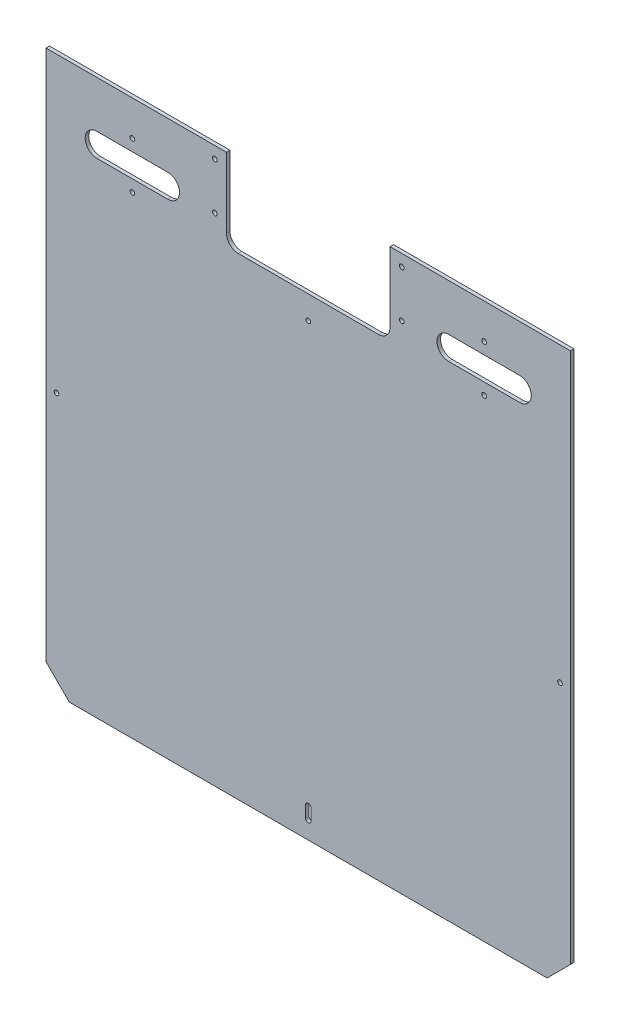
ISO-10303-21;
HEADER;
FILE_DESCRIPTION(('STEP AP214'),'2;1');
FILE_NAME('part.step','',(''),(''),'','','');
FILE_SCHEMA(('AUTOMOTIVE_DESIGN { 1 0 10303 214 1 1 1 1 }'));
ENDSEC;
DATA;
#1=APPLICATION_CONTEXT('core data for automotive mechanical design processes');
#2=APPLICATION_PROTOCOL_DEFINITION('international standard','automotive_design',2000,#1);
#3=PRODUCT_CONTEXT('',#1,'mechanical');
#4=PRODUCT('Part','Part','',(#3));
#5=PRODUCT_RELATED_PRODUCT_CATEGORY('part','',(#4));
#6=PRODUCT_DEFINITION_FORMATION('','',#4);
#7=PRODUCT_DEFINITION_CONTEXT('part definition',#1,'design');
#8=PRODUCT_DEFINITION('design','',#6,#7);
#9=PRODUCT_DEFINITION_SHAPE('','',#8);
#10=(LENGTH_UNIT() NAMED_UNIT(*) SI_UNIT(.MILLI.,.METRE.));
#11=(NAMED_UNIT(*) PLANE_ANGLE_UNIT() SI_UNIT($,.RADIAN.));
#12=(NAMED_UNIT(*) SI_UNIT($,.STERADIAN.) SOLID_ANGLE_UNIT());
#13=UNCERTAINTY_MEASURE_WITH_UNIT(LENGTH_MEASURE(1.E-05),#10,'distance_accuracy_value','');
#14=(GEOMETRIC_REPRESENTATION_CONTEXT(3) GLOBAL_UNCERTAINTY_ASSIGNED_CONTEXT((#13)) GLOBAL_UNIT_ASSIGNED_CONTEXT((#10,
#11,#12)) REPRESENTATION_CONTEXT('',''));
#15=CARTESIAN_POINT('',(0.,0.,0.));
#16=DIRECTION('',(0.,0.,1.));
#17=DIRECTION('',(1.,0.,0.));
#18=AXIS2_PLACEMENT_3D('',#15,#16,#17);
#19=CARTESIAN_POINT('',(164.5,415.,3.));
#20=DIRECTION('',(0.,0.,1.));
#21=DIRECTION('',(1.,0.,0.));
#22=AXIS2_PLACEMENT_3D('',#19,#20,#21);
#23=PLANE('',#22);
#24=CARTESIAN_POINT('',(304.5,425.,3.));
#25=DIRECTION('',(0.,0.,1.));
#26=DIRECTION('',(-1.,0.,0.));
#27=AXIS2_PLACEMENT_3D('',#24,#25,#26);
#28=CIRCLE('',#27,2.);
#29=CARTESIAN_POINT('',(302.5,425.,3.));
#30=VERTEX_POINT('',#29);
#31=EDGE_CURVE('E815',#30,#30,#28,.T.);
#32=ORIENTED_EDGE('',*,*,#31,.F.);
#33=EDGE_LOOP('',(#32));
#34=FACE_BOUND('',#33,.T.);
#35=CARTESIAN_POINT('',(375.078127511441,445.,3.));
#36=DIRECTION('',(0.,0.,1.));
#37=DIRECTION('',(-1.,0.,0.));
#38=AXIS2_PLACEMENT_3D('',#35,#36,#37);
#39=CIRCLE('',#38,2.);
#40=CARTESIAN_POINT('',(373.078127511441,445.,3.));
#41=VERTEX_POINT('',#40);
#42=EDGE_CURVE('E827',#41,#41,#39,.T.);
#43=ORIENTED_EDGE('',*,*,#42,.F.);
#44=EDGE_LOOP('',(#43));
#45=FACE_BOUND('',#44,.T.);
#46=CARTESIAN_POINT('',(73.9218724885587,405.,3.));
#47=DIRECTION('',(0.,0.,1.));
#48=DIRECTION('',(-1.,0.,0.));
#49=AXIS2_PLACEMENT_3D('',#46,#47,#48);
#50=CIRCLE('',#49,2.);
#51=CARTESIAN_POINT('',(71.9218724885587,405.,3.));
#52=VERTEX_POINT('',#51);
#53=EDGE_CURVE('E839',#52,#52,#50,.T.);
#54=ORIENTED_EDGE('',*,*,#53,.F.);
#55=EDGE_LOOP('',(#54));
#56=FACE_BOUND('',#55,.T.);
#57=DIRECTION('',(0.,1.,0.));
#58=VECTOR('',#57,1.);
#59=CARTESIAN_POINT('',(226.75,15.,3.));
#60=LINE('',#59,#58);
#61=CARTESIAN_POINT('',(226.75,15.,3.));
#62=VERTEX_POINT('',#61);
#63=CARTESIAN_POINT('',(226.75,25.,3.));
#64=VERTEX_POINT('',#63);
#65=EDGE_CURVE('E204',#62,#64,#60,.T.);
#66=ORIENTED_EDGE('',*,*,#65,.F.);
#67=CARTESIAN_POINT('',(224.5,15.,3.));
#68=DIRECTION('',(0.,0.,1.));
#69=DIRECTION('',(1.,0.,0.));
#70=AXIS2_PLACEMENT_3D('',#67,#68,#69);
#71=CIRCLE('',#70,2.24999999999997);
#72=CARTESIAN_POINT('',(222.25,15.,3.));
#73=VERTEX_POINT('',#72);
#74=EDGE_CURVE('E196',#73,#62,#71,.T.);
#75=ORIENTED_EDGE('',*,*,#74,.F.);
#76=DIRECTION('',(0.,-1.,0.));
#77=VECTOR('',#76,1.);
#78=CARTESIAN_POINT('',(222.25,15.,3.));
#79=LINE('',#78,#77);
#80=CARTESIAN_POINT('',(222.25,25.,3.));
#81=VERTEX_POINT('',#80);
#82=EDGE_CURVE('E219',#81,#73,#79,.T.);
#83=ORIENTED_EDGE('',*,*,#82,.F.);
#84=CARTESIAN_POINT('',(224.5,25.,3.));
#85=DIRECTION('',(0.,0.,1.));
#86=DIRECTION('',(1.,0.,0.));
#87=AXIS2_PLACEMENT_3D('',#84,#85,#86);
#88=CIRCLE('',#87,2.25);
#89=EDGE_CURVE('E217',#64,#81,#88,.T.);
#90=ORIENTED_EDGE('',*,*,#89,.F.);
#91=EDGE_LOOP('',(#66,#75,#83,#90));
#92=FACE_BOUND('',#91,.T.);
#93=DIRECTION('',(1.,0.,0.));
#94=VECTOR('',#93,1.);
#95=CARTESIAN_POINT('',(344.715899344631,415.,3.));
#96=LINE('',#95,#94);
#97=CARTESIAN_POINT('',(344.715899344631,415.,3.));
#98=VERTEX_POINT('',#97);
#99=CARTESIAN_POINT('',(405.440355678252,415.,3.));
#100=VERTEX_POINT('',#99);
#101=EDGE_CURVE('E268',#98,#100,#96,.T.);
#102=ORIENTED_EDGE('',*,*,#101,.F.);
#103=CARTESIAN_POINT('',(344.715899344631,425.,3.));
#104=DIRECTION('',(0.,0.,1.));
#105=DIRECTION('',(1.,0.,0.));
#106=AXIS2_PLACEMENT_3D('',#103,#104,#105);
#107=CIRCLE('',#106,9.99999999999995);
#108=CARTESIAN_POINT('',(344.715899344631,435.,3.));
#109=VERTEX_POINT('',#108);
#110=EDGE_CURVE('E266',#109,#98,#107,.T.);
#111=ORIENTED_EDGE('',*,*,#110,.F.);
#112=DIRECTION('',(-1.,0.,0.));
#113=VECTOR('',#112,1.);
#114=CARTESIAN_POINT('',(344.715899344631,435.,3.));
#115=LINE('',#114,#113);
#116=CARTESIAN_POINT('',(405.440355678252,435.,3.));
#117=VERTEX_POINT('',#116);
#118=EDGE_CURVE('E274',#117,#109,#115,.T.);
#119=ORIENTED_EDGE('',*,*,#118,.F.);
#120=CARTESIAN_POINT('',(405.440355678252,425.,3.));
#121=DIRECTION('',(0.,0.,1.));
#122=DIRECTION('',(1.,0.,0.));
#123=AXIS2_PLACEMENT_3D('',#120,#121,#122);
#124=CIRCLE('',#123,9.99999999999995);
#125=EDGE_CURVE('E271',#100,#117,#124,.T.);
#126=ORIENTED_EDGE('',*,*,#125,.F.);
#127=EDGE_LOOP('',(#102,#111,#119,#126));
#128=FACE_BOUND('',#127,.T.);
#129=CARTESIAN_POINT('',(9.,223.826386398669,3.));
#130=DIRECTION('',(0.,0.,1.));
#131=DIRECTION('',(1.,0.,0.));
#132=AXIS2_PLACEMENT_3D('',#129,#130,#131);
#133=CIRCLE('',#132,2.);
#134=CARTESIAN_POINT('',(11.,223.826386398669,3.));
#135=VERTEX_POINT('',#134);
#136=EDGE_CURVE('E303',#135,#135,#133,.T.);
#137=ORIENTED_EDGE('',*,*,#136,.F.);
#138=EDGE_LOOP('',(#137));
#139=FACE_BOUND('',#138,.T.);
#140=CARTESIAN_POINT('',(144.5,425.,3.));
#141=DIRECTION('',(0.,0.,1.));
#142=DIRECTION('',(1.,0.,0.));
#143=AXIS2_PLACEMENT_3D('',#140,#141,#142);
#144=CIRCLE('',#143,2.);
#145=CARTESIAN_POINT('',(146.5,425.,3.));
#146=VERTEX_POINT('',#145);
#147=EDGE_CURVE('E315',#146,#146,#144,.T.);
#148=ORIENTED_EDGE('',*,*,#147,.F.);
#149=EDGE_LOOP('',(#148));
#150=FACE_BOUND('',#149,.T.);
#151=DIRECTION('',(-1.,0.,0.));
#152=VECTOR('',#151,1.);
#153=CARTESIAN_POINT('',(0.,475.,3.));
#154=LINE('',#153,#152);
#155=CARTESIAN_POINT('',(154.5,475.,3.));
#156=VERTEX_POINT('',#155);
#157=CARTESIAN_POINT('',(0.,475.,3.));
#158=VERTEX_POINT('',#157);
#159=EDGE_CURVE('E321',#156,#158,#154,.T.);
#160=ORIENTED_EDGE('',*,*,#159,.T.);
#161=DIRECTION('',(0.,-1.,0.));
#162=VECTOR('',#161,1.);
#163=CARTESIAN_POINT('',(0.,20.,3.));
#164=LINE('',#163,#162);
#165=CARTESIAN_POINT('',(0.,20.,3.));
#166=VERTEX_POINT('',#165);
#167=EDGE_CURVE('E324',#158,#166,#164,.T.);
#168=ORIENTED_EDGE('',*,*,#167,.T.);
#169=DIRECTION('',(0.707106781186548,-0.707106781186548,0.));
#170=VECTOR('',#169,1.);
#171=CARTESIAN_POINT('',(20.,0.,3.));
#172=LINE('',#171,#170);
#173=CARTESIAN_POINT('',(20.,0.,3.));
#174=VERTEX_POINT('',#173);
#175=EDGE_CURVE('E327',#166,#174,#172,.T.);
#176=ORIENTED_EDGE('',*,*,#175,.T.);
#177=DIRECTION('',(1.,0.,0.));
#178=VECTOR('',#177,1.);
#179=CARTESIAN_POINT('',(429.,0.,3.));
#180=LINE('',#179,#178);
#181=CARTESIAN_POINT('',(429.,0.,3.));
#182=VERTEX_POINT('',#181);
#183=EDGE_CURVE('E329',#174,#182,#180,.T.);
#184=ORIENTED_EDGE('',*,*,#183,.T.);
#185=DIRECTION('',(0.70710678118655,0.707106781186545,0.));
#186=VECTOR('',#185,1.);
#187=CARTESIAN_POINT('',(449.,20.,3.));
#188=LINE('',#187,#186);
#189=CARTESIAN_POINT('',(449.,20.,3.));
#190=VERTEX_POINT('',#189);
#191=EDGE_CURVE('E331',#182,#190,#188,.T.);
#192=ORIENTED_EDGE('',*,*,#191,.T.);
#193=DIRECTION('',(0.,1.,0.));
#194=VECTOR('',#193,1.);
#195=CARTESIAN_POINT('',(449.,475.,3.));
#196=LINE('',#195,#194);
#197=CARTESIAN_POINT('',(449.,475.,3.));
#198=VERTEX_POINT('',#197);
#199=EDGE_CURVE('E333',#190,#198,#196,.T.);
#200=ORIENTED_EDGE('',*,*,#199,.T.);
#201=DIRECTION('',(-1.,0.,0.));
#202=VECTOR('',#201,1.);
#203=CARTESIAN_POINT('',(294.5,475.,3.));
#204=LINE('',#203,#202);
#205=CARTESIAN_POINT('',(294.5,475.,3.));
#206=VERTEX_POINT('',#205);
#207=EDGE_CURVE('E335',#198,#206,#204,.T.);
#208=ORIENTED_EDGE('',*,*,#207,.T.);
#209=DIRECTION('',(0.,-1.,0.));
#210=VECTOR('',#209,1.);
#211=CARTESIAN_POINT('',(294.5,415.,3.));
#212=LINE('',#211,#210);
#213=CARTESIAN_POINT('',(294.5,415.,3.));
#214=VERTEX_POINT('',#213);
#215=EDGE_CURVE('E337',#206,#214,#212,.T.);
#216=ORIENTED_EDGE('',*,*,#215,.T.);
#217=CARTESIAN_POINT('',(284.5,415.,3.));
#218=DIRECTION('',(0.,0.,-1.));
#219=DIRECTION('',(-1.,0.,0.));
#220=AXIS2_PLACEMENT_3D('',#217,#218,#219);
#221=CIRCLE('',#220,10.);
#222=CARTESIAN_POINT('',(284.5,405.,3.));
#223=VERTEX_POINT('',#222);
#224=EDGE_CURVE('E339',#214,#223,#221,.T.);
#225=ORIENTED_EDGE('',*,*,#224,.T.);
#226=DIRECTION('',(-1.,0.,0.));
#227=VECTOR('',#226,1.);
#228=CARTESIAN_POINT('',(164.5,405.,3.));
#229=LINE('',#228,#227);
#230=CARTESIAN_POINT('',(164.5,405.,3.));
#231=VERTEX_POINT('',#230);
#232=EDGE_CURVE('E341',#223,#231,#229,.T.);
#233=ORIENTED_EDGE('',*,*,#232,.T.);
#234=CARTESIAN_POINT('',(164.5,415.,3.));
#235=DIRECTION('',(0.,0.,-1.));
#236=DIRECTION('',(1.,0.,0.));
#237=AXIS2_PLACEMENT_3D('',#234,#235,#236);
#238=CIRCLE('',#237,10.);
#239=CARTESIAN_POINT('',(154.5,415.,3.));
#240=VERTEX_POINT('',#239);
#241=EDGE_CURVE('E343',#231,#240,#238,.T.);
#242=ORIENTED_EDGE('',*,*,#241,.T.);
#243=DIRECTION('',(0.,1.,0.));
#244=VECTOR('',#243,1.);
#245=CARTESIAN_POINT('',(154.5,475.,3.));
#246=LINE('',#245,#244);
#247=EDGE_CURVE('E345',#240,#156,#246,.T.);
#248=ORIENTED_EDGE('',*,*,#247,.T.);
#249=EDGE_LOOP('',(#160,#168,#176,#184,#192,#200,#208,#216,#225,#233,#242,#248));
#250=FACE_BOUND('',#249,.T.);
#251=CARTESIAN_POINT('',(224.5,385.,3.));
#252=DIRECTION('',(0.,0.,1.));
#253=DIRECTION('',(1.,0.,0.));
#254=AXIS2_PLACEMENT_3D('',#251,#252,#253);
#255=CIRCLE('',#254,2.);
#256=CARTESIAN_POINT('',(226.5,385.,3.));
#257=VERTEX_POINT('',#256);
#258=EDGE_CURVE('E309',#257,#257,#255,.T.);
#259=ORIENTED_EDGE('',*,*,#258,.F.);
#260=EDGE_LOOP('',(#259));
#261=FACE_BOUND('',#260,.T.);
#262=CARTESIAN_POINT('',(440.,224.5,3.));
#263=DIRECTION('',(0.,0.,1.));
#264=DIRECTION('',(1.,0.,0.));
#265=AXIS2_PLACEMENT_3D('',#262,#263,#264);
#266=CIRCLE('',#265,2.);
#267=CARTESIAN_POINT('',(442.,224.5,3.));
#268=VERTEX_POINT('',#267);
#269=EDGE_CURVE('E297',#268,#268,#266,.T.);
#270=ORIENTED_EDGE('',*,*,#269,.F.);
#271=EDGE_LOOP('',(#270));
#272=FACE_BOUND('',#271,.T.);
#273=DIRECTION('',(-1.,0.,0.));
#274=VECTOR('',#273,1.);
#275=CARTESIAN_POINT('',(104.284100655369,435.,3.));
#276=LINE('',#275,#274);
#277=CARTESIAN_POINT('',(104.284100655369,435.,3.));
#278=VERTEX_POINT('',#277);
#279=CARTESIAN_POINT('',(43.5596443217483,435.,3.));
#280=VERTEX_POINT('',#279);
#281=EDGE_CURVE('E237',#278,#280,#276,.T.);
#282=ORIENTED_EDGE('',*,*,#281,.F.);
#283=CARTESIAN_POINT('',(104.284100655369,425.,3.));
#284=DIRECTION('',(0.,0.,1.));
#285=DIRECTION('',(-1.,0.,0.));
#286=AXIS2_PLACEMENT_3D('',#283,#284,#285);
#287=CIRCLE('',#286,9.99999999999995);
#288=CARTESIAN_POINT('',(104.284100655369,415.,3.));
#289=VERTEX_POINT('',#288);
#290=EDGE_CURVE('E235',#289,#278,#287,.T.);
#291=ORIENTED_EDGE('',*,*,#290,.F.);
#292=DIRECTION('',(1.,0.,0.));
#293=VECTOR('',#292,1.);
#294=CARTESIAN_POINT('',(104.284100655369,415.,3.));
#295=LINE('',#294,#293);
#296=CARTESIAN_POINT('',(43.5596443217483,415.,3.));
#297=VERTEX_POINT('',#296);
#298=EDGE_CURVE('E243',#297,#289,#295,.T.);
#299=ORIENTED_EDGE('',*,*,#298,.F.);
#300=CARTESIAN_POINT('',(43.5596443217483,425.,3.));
#301=DIRECTION('',(0.,0.,1.));
#302=DIRECTION('',(-1.,0.,0.));
#303=AXIS2_PLACEMENT_3D('',#300,#301,#302);
#304=CIRCLE('',#303,9.99999999999995);
#305=EDGE_CURVE('E240',#280,#297,#304,.T.);
#306=ORIENTED_EDGE('',*,*,#305,.F.);
#307=EDGE_LOOP('',(#282,#291,#299,#306));
#308=FACE_BOUND('',#307,.T.);
#309=CARTESIAN_POINT('',(73.9218724885587,445.,3.));
#310=DIRECTION('',(0.,0.,1.));
#311=DIRECTION('',(1.,0.,0.));
#312=AXIS2_PLACEMENT_3D('',#309,#310,#311);
#313=CIRCLE('',#312,2.);
#314=CARTESIAN_POINT('',(75.9218724885587,445.,3.));
#315=VERTEX_POINT('',#314);
#316=EDGE_CURVE('E225',#315,#315,#313,.T.);
#317=ORIENTED_EDGE('',*,*,#316,.F.);
#318=EDGE_LOOP('',(#317));
#319=FACE_BOUND('',#318,.T.);
#320=CARTESIAN_POINT('',(375.078127511441,405.,3.));
#321=DIRECTION('',(0.,0.,1.));
#322=DIRECTION('',(1.,0.,0.));
#323=AXIS2_PLACEMENT_3D('',#320,#321,#322);
#324=CIRCLE('',#323,2.);
#325=CARTESIAN_POINT('',(377.078127511441,405.,3.));
#326=VERTEX_POINT('',#325);
#327=EDGE_CURVE('E833',#326,#326,#324,.T.);
#328=ORIENTED_EDGE('',*,*,#327,.F.);
#329=EDGE_LOOP('',(#328));
#330=FACE_BOUND('',#329,.T.);
#331=CARTESIAN_POINT('',(144.5,465.,3.));
#332=DIRECTION('',(0.,0.,1.));
#333=DIRECTION('',(-1.,0.,0.));
#334=AXIS2_PLACEMENT_3D('',#331,#332,#333);
#335=CIRCLE('',#334,2.);
#336=CARTESIAN_POINT('',(142.5,465.,3.));
#337=VERTEX_POINT('',#336);
#338=EDGE_CURVE('E821',#337,#337,#335,.T.);
#339=ORIENTED_EDGE('',*,*,#338,.F.);
#340=EDGE_LOOP('',(#339));
#341=FACE_BOUND('',#340,.T.);
#342=CARTESIAN_POINT('',(304.5,465.,3.));
#343=DIRECTION('',(0.,0.,1.));
#344=DIRECTION('',(1.,0.,0.));
#345=AXIS2_PLACEMENT_3D('',#342,#343,#344);
#346=CIRCLE('',#345,2.);
#347=CARTESIAN_POINT('',(306.5,465.,3.));
#348=VERTEX_POINT('',#347);
#349=EDGE_CURVE('E806',#348,#348,#346,.T.);
#350=ORIENTED_EDGE('',*,*,#349,.F.);
#351=EDGE_LOOP('',(#350));
#352=FACE_BOUND('',#351,.T.);
#353=ADVANCED_FACE('F35',(#34,#45,#56,#92,#128,#139,#150,#250,#261,#272,#308,#319,#330,#341,
#352),#23,.T.);
#354=CARTESIAN_POINT('',(164.5,415.,0.));
#355=DIRECTION('',(0.,0.,1.));
#356=DIRECTION('',(1.,0.,0.));
#357=AXIS2_PLACEMENT_3D('',#354,#355,#356);
#358=PLANE('',#357);
#359=CARTESIAN_POINT('',(304.5,425.,0.));
#360=DIRECTION('',(0.,0.,1.));
#361=DIRECTION('',(-1.,0.,0.));
#362=AXIS2_PLACEMENT_3D('',#359,#360,#361);
#363=CIRCLE('',#362,2.);
#364=CARTESIAN_POINT('',(302.5,425.,0.));
#365=VERTEX_POINT('',#364);
#366=EDGE_CURVE('E812',#365,#365,#363,.T.);
#367=ORIENTED_EDGE('',*,*,#366,.T.);
#368=EDGE_LOOP('',(#367));
#369=FACE_BOUND('',#368,.T.);
#370=CARTESIAN_POINT('',(375.078127511441,445.,0.));
#371=DIRECTION('',(0.,0.,1.));
#372=DIRECTION('',(-1.,0.,0.));
#373=AXIS2_PLACEMENT_3D('',#370,#371,#372);
#374=CIRCLE('',#373,2.);
#375=CARTESIAN_POINT('',(373.078127511441,445.,0.));
#376=VERTEX_POINT('',#375);
#377=EDGE_CURVE('E824',#376,#376,#374,.T.);
#378=ORIENTED_EDGE('',*,*,#377,.T.);
#379=EDGE_LOOP('',(#378));
#380=FACE_BOUND('',#379,.T.);
#381=CARTESIAN_POINT('',(73.9218724885587,405.,0.));
#382=DIRECTION('',(0.,0.,1.));
#383=DIRECTION('',(-1.,0.,0.));
#384=AXIS2_PLACEMENT_3D('',#381,#382,#383);
#385=CIRCLE('',#384,2.);
#386=CARTESIAN_POINT('',(71.9218724885587,405.,0.));
#387=VERTEX_POINT('',#386);
#388=EDGE_CURVE('E836',#387,#387,#385,.T.);
#389=ORIENTED_EDGE('',*,*,#388,.T.);
#390=EDGE_LOOP('',(#389));
#391=FACE_BOUND('',#390,.T.);
#392=CARTESIAN_POINT('',(224.5,15.,0.));
#393=DIRECTION('',(0.,0.,1.));
#394=DIRECTION('',(1.,0.,0.));
#395=AXIS2_PLACEMENT_3D('',#392,#393,#394);
#396=CIRCLE('',#395,2.24999999999997);
#397=CARTESIAN_POINT('',(222.25,15.,0.));
#398=VERTEX_POINT('',#397);
#399=CARTESIAN_POINT('',(226.75,15.,0.));
#400=VERTEX_POINT('',#399);
#401=EDGE_CURVE('E58',#398,#400,#396,.T.);
#402=ORIENTED_EDGE('',*,*,#401,.T.);
#403=DIRECTION('',(0.,1.,0.));
#404=VECTOR('',#403,1.);
#405=CARTESIAN_POINT('',(226.75,15.,0.));
#406=LINE('',#405,#404);
#407=CARTESIAN_POINT('',(226.75,25.,0.));
#408=VERTEX_POINT('',#407);
#409=EDGE_CURVE('E211',#400,#408,#406,.T.);
#410=ORIENTED_EDGE('',*,*,#409,.T.);
#411=CARTESIAN_POINT('',(224.5,25.,0.));
#412=DIRECTION('',(0.,0.,1.));
#413=DIRECTION('',(1.,0.,0.));
#414=AXIS2_PLACEMENT_3D('',#411,#412,#413);
#415=CIRCLE('',#414,2.25);
#416=CARTESIAN_POINT('',(222.25,25.,0.));
#417=VERTEX_POINT('',#416);
#418=EDGE_CURVE('E227',#408,#417,#415,.T.);
#419=ORIENTED_EDGE('',*,*,#418,.T.);
#420=DIRECTION('',(0.,-1.,0.));
#421=VECTOR('',#420,1.);
#422=CARTESIAN_POINT('',(222.25,15.,0.));
#423=LINE('',#422,#421);
#424=EDGE_CURVE('E205',#417,#398,#423,.T.);
#425=ORIENTED_EDGE('',*,*,#424,.T.);
#426=EDGE_LOOP('',(#402,#410,#419,#425));
#427=FACE_BOUND('',#426,.T.);
#428=CARTESIAN_POINT('',(344.715899344631,425.,0.));
#429=DIRECTION('',(0.,0.,1.));
#430=DIRECTION('',(1.,0.,0.));
#431=AXIS2_PLACEMENT_3D('',#428,#429,#430);
#432=CIRCLE('',#431,9.99999999999995);
#433=CARTESIAN_POINT('',(344.715899344631,435.,0.));
#434=VERTEX_POINT('',#433);
#435=CARTESIAN_POINT('',(344.715899344631,415.,0.));
#436=VERTEX_POINT('',#435);
#437=EDGE_CURVE('E265',#434,#436,#432,.T.);
#438=ORIENTED_EDGE('',*,*,#437,.T.);
#439=DIRECTION('',(1.,0.,0.));
#440=VECTOR('',#439,1.);
#441=CARTESIAN_POINT('',(344.715899344631,415.,0.));
#442=LINE('',#441,#440);
#443=CARTESIAN_POINT('',(405.440355678252,415.,0.));
#444=VERTEX_POINT('',#443);
#445=EDGE_CURVE('E279',#436,#444,#442,.T.);
#446=ORIENTED_EDGE('',*,*,#445,.T.);
#447=CARTESIAN_POINT('',(405.440355678252,425.,0.));
#448=DIRECTION('',(0.,0.,1.));
#449=DIRECTION('',(1.,0.,0.));
#450=AXIS2_PLACEMENT_3D('',#447,#448,#449);
#451=CIRCLE('',#450,9.99999999999995);
#452=CARTESIAN_POINT('',(405.440355678252,435.,0.));
#453=VERTEX_POINT('',#452);
#454=EDGE_CURVE('E282',#444,#453,#451,.T.);
#455=ORIENTED_EDGE('',*,*,#454,.T.);
#456=DIRECTION('',(-1.,0.,0.));
#457=VECTOR('',#456,1.);
#458=CARTESIAN_POINT('',(344.715899344631,435.,0.));
#459=LINE('',#458,#457);
#460=EDGE_CURVE('E269',#453,#434,#459,.T.);
#461=ORIENTED_EDGE('',*,*,#460,.T.);
#462=EDGE_LOOP('',(#438,#446,#455,#461));
#463=FACE_BOUND('',#462,.T.);
#464=CARTESIAN_POINT('',(9.,223.826386398669,0.));
#465=DIRECTION('',(0.,0.,1.));
#466=DIRECTION('',(1.,0.,0.));
#467=AXIS2_PLACEMENT_3D('',#464,#465,#466);
#468=CIRCLE('',#467,2.);
#469=CARTESIAN_POINT('',(11.,223.826386398669,0.));
#470=VERTEX_POINT('',#469);
#471=EDGE_CURVE('E300',#470,#470,#468,.T.);
#472=ORIENTED_EDGE('',*,*,#471,.T.);
#473=EDGE_LOOP('',(#472));
#474=FACE_BOUND('',#473,.T.);
#475=CARTESIAN_POINT('',(144.5,425.,0.));
#476=DIRECTION('',(0.,0.,1.));
#477=DIRECTION('',(1.,0.,0.));
#478=AXIS2_PLACEMENT_3D('',#475,#476,#477);
#479=CIRCLE('',#478,2.);
#480=CARTESIAN_POINT('',(146.5,425.,0.));
#481=VERTEX_POINT('',#480);
#482=EDGE_CURVE('E312',#481,#481,#479,.T.);
#483=ORIENTED_EDGE('',*,*,#482,.T.);
#484=EDGE_LOOP('',(#483));
#485=FACE_BOUND('',#484,.T.);
#486=DIRECTION('',(-1.,0.,0.));
#487=VECTOR('',#486,1.);
#488=CARTESIAN_POINT('',(0.,475.,0.));
#489=LINE('',#488,#487);
#490=CARTESIAN_POINT('',(154.5,475.,0.));
#491=VERTEX_POINT('',#490);
#492=CARTESIAN_POINT('',(0.,475.,0.));
#493=VERTEX_POINT('',#492);
#494=EDGE_CURVE('E318',#491,#493,#489,.T.);
#495=ORIENTED_EDGE('',*,*,#494,.F.);
#496=DIRECTION('',(0.,1.,0.));
#497=VECTOR('',#496,1.);
#498=CARTESIAN_POINT('',(154.5,475.,0.));
#499=LINE('',#498,#497);
#500=CARTESIAN_POINT('',(154.5,415.,0.));
#501=VERTEX_POINT('',#500);
#502=EDGE_CURVE('E325',#501,#491,#499,.T.);
#503=ORIENTED_EDGE('',*,*,#502,.F.);
#504=CARTESIAN_POINT('',(164.5,415.,0.));
#505=DIRECTION('',(0.,0.,-1.));
#506=DIRECTION('',(1.,0.,0.));
#507=AXIS2_PLACEMENT_3D('',#504,#505,#506);
#508=CIRCLE('',#507,10.);
#509=CARTESIAN_POINT('',(164.5,405.,0.));
#510=VERTEX_POINT('',#509);
#511=EDGE_CURVE('E368',#510,#501,#508,.T.);
#512=ORIENTED_EDGE('',*,*,#511,.F.);
#513=DIRECTION('',(-1.,0.,0.));
#514=VECTOR('',#513,1.);
#515=CARTESIAN_POINT('',(164.5,405.,0.));
#516=LINE('',#515,#514);
#517=CARTESIAN_POINT('',(284.5,405.,0.));
#518=VERTEX_POINT('',#517);
#519=EDGE_CURVE('E366',#518,#510,#516,.T.);
#520=ORIENTED_EDGE('',*,*,#519,.F.);
#521=CARTESIAN_POINT('',(284.5,415.,0.));
#522=DIRECTION('',(0.,0.,-1.));
#523=DIRECTION('',(-1.,0.,0.));
#524=AXIS2_PLACEMENT_3D('',#521,#522,#523);
#525=CIRCLE('',#524,10.);
#526=CARTESIAN_POINT('',(294.5,415.,0.));
#527=VERTEX_POINT('',#526);
#528=EDGE_CURVE('E364',#527,#518,#525,.T.);
#529=ORIENTED_EDGE('',*,*,#528,.F.);
#530=DIRECTION('',(0.,-1.,0.));
#531=VECTOR('',#530,1.);
#532=CARTESIAN_POINT('',(294.5,415.,0.));
#533=LINE('',#532,#531);
#534=CARTESIAN_POINT('',(294.5,475.,0.));
#535=VERTEX_POINT('',#534);
#536=EDGE_CURVE('E362',#535,#527,#533,.T.);
#537=ORIENTED_EDGE('',*,*,#536,.F.);
#538=DIRECTION('',(-1.,0.,0.));
#539=VECTOR('',#538,1.);
#540=CARTESIAN_POINT('',(294.5,475.,0.));
#541=LINE('',#540,#539);
#542=CARTESIAN_POINT('',(449.,475.,0.));
#543=VERTEX_POINT('',#542);
#544=EDGE_CURVE('E360',#543,#535,#541,.T.);
#545=ORIENTED_EDGE('',*,*,#544,.F.);
#546=DIRECTION('',(0.,1.,0.));
#547=VECTOR('',#546,1.);
#548=CARTESIAN_POINT('',(449.,475.,0.));
#549=LINE('',#548,#547);
#550=CARTESIAN_POINT('',(449.,20.,0.));
#551=VERTEX_POINT('',#550);
#552=EDGE_CURVE('E358',#551,#543,#549,.T.);
#553=ORIENTED_EDGE('',*,*,#552,.F.);
#554=DIRECTION('',(0.70710678118655,0.707106781186545,0.));
#555=VECTOR('',#554,1.);
#556=CARTESIAN_POINT('',(449.,20.,0.));
#557=LINE('',#556,#555);
#558=CARTESIAN_POINT('',(429.,0.,0.));
#559=VERTEX_POINT('',#558);
#560=EDGE_CURVE('E356',#559,#551,#557,.T.);
#561=ORIENTED_EDGE('',*,*,#560,.F.);
#562=DIRECTION('',(1.,0.,0.));
#563=VECTOR('',#562,1.);
#564=CARTESIAN_POINT('',(429.,0.,0.));
#565=LINE('',#564,#563);
#566=CARTESIAN_POINT('',(20.,0.,0.));
#567=VERTEX_POINT('',#566);
#568=EDGE_CURVE('E354',#567,#559,#565,.T.);
#569=ORIENTED_EDGE('',*,*,#568,.F.);
#570=DIRECTION('',(0.707106781186548,-0.707106781186548,0.));
#571=VECTOR('',#570,1.);
#572=CARTESIAN_POINT('',(20.,0.,0.));
#573=LINE('',#572,#571);
#574=CARTESIAN_POINT('',(0.,20.,0.));
#575=VERTEX_POINT('',#574);
#576=EDGE_CURVE('E352',#575,#567,#573,.T.);
#577=ORIENTED_EDGE('',*,*,#576,.F.);
#578=DIRECTION('',(0.,-1.,0.));
#579=VECTOR('',#578,1.);
#580=CARTESIAN_POINT('',(0.,20.,0.));
#581=LINE('',#580,#579);
#582=EDGE_CURVE('E350',#493,#575,#581,.T.);
#583=ORIENTED_EDGE('',*,*,#582,.F.);
#584=EDGE_LOOP('',(#495,#503,#512,#520,#529,#537,#545,#553,#561,#569,#577,#583));
#585=FACE_BOUND('',#584,.T.);
#586=CARTESIAN_POINT('',(224.5,385.,0.));
#587=DIRECTION('',(0.,0.,1.));
#588=DIRECTION('',(1.,0.,0.));
#589=AXIS2_PLACEMENT_3D('',#586,#587,#588);
#590=CIRCLE('',#589,2.);
#591=CARTESIAN_POINT('',(226.5,385.,0.));
#592=VERTEX_POINT('',#591);
#593=EDGE_CURVE('E306',#592,#592,#590,.T.);
#594=ORIENTED_EDGE('',*,*,#593,.T.);
#595=EDGE_LOOP('',(#594));
#596=FACE_BOUND('',#595,.T.);
#597=CARTESIAN_POINT('',(440.,224.5,0.));
#598=DIRECTION('',(0.,0.,1.));
#599=DIRECTION('',(1.,0.,0.));
#600=AXIS2_PLACEMENT_3D('',#597,#598,#599);
#601=CIRCLE('',#600,2.);
#602=CARTESIAN_POINT('',(442.,224.5,0.));
#603=VERTEX_POINT('',#602);
#604=EDGE_CURVE('E296',#603,#603,#601,.T.);
#605=ORIENTED_EDGE('',*,*,#604,.T.);
#606=EDGE_LOOP('',(#605));
#607=FACE_BOUND('',#606,.T.);
#608=CARTESIAN_POINT('',(104.284100655369,425.,0.));
#609=DIRECTION('',(0.,0.,1.));
#610=DIRECTION('',(-1.,0.,0.));
#611=AXIS2_PLACEMENT_3D('',#608,#609,#610);
#612=CIRCLE('',#611,9.99999999999995);
#613=CARTESIAN_POINT('',(104.284100655369,415.,0.));
#614=VERTEX_POINT('',#613);
#615=CARTESIAN_POINT('',(104.284100655369,435.,0.));
#616=VERTEX_POINT('',#615);
#617=EDGE_CURVE('E212',#614,#616,#612,.T.);
#618=ORIENTED_EDGE('',*,*,#617,.T.);
#619=DIRECTION('',(-1.,0.,0.));
#620=VECTOR('',#619,1.);
#621=CARTESIAN_POINT('',(104.284100655369,435.,0.));
#622=LINE('',#621,#620);
#623=CARTESIAN_POINT('',(43.5596443217483,435.,0.));
#624=VERTEX_POINT('',#623);
#625=EDGE_CURVE('E248',#616,#624,#622,.T.);
#626=ORIENTED_EDGE('',*,*,#625,.T.);
#627=CARTESIAN_POINT('',(43.5596443217483,425.,0.));
#628=DIRECTION('',(0.,0.,1.));
#629=DIRECTION('',(-1.,0.,0.));
#630=AXIS2_PLACEMENT_3D('',#627,#628,#629);
#631=CIRCLE('',#630,9.99999999999995);
#632=CARTESIAN_POINT('',(43.5596443217483,415.,0.));
#633=VERTEX_POINT('',#632);
#634=EDGE_CURVE('E251',#624,#633,#631,.T.);
#635=ORIENTED_EDGE('',*,*,#634,.T.);
#636=DIRECTION('',(1.,0.,0.));
#637=VECTOR('',#636,1.);
#638=CARTESIAN_POINT('',(104.284100655369,415.,0.));
#639=LINE('',#638,#637);
#640=EDGE_CURVE('E238',#633,#614,#639,.T.);
#641=ORIENTED_EDGE('',*,*,#640,.T.);
#642=EDGE_LOOP('',(#618,#626,#635,#641));
#643=FACE_BOUND('',#642,.T.);
#644=CARTESIAN_POINT('',(73.9218724885587,445.,0.));
#645=DIRECTION('',(0.,0.,1.));
#646=DIRECTION('',(1.,0.,0.));
#647=AXIS2_PLACEMENT_3D('',#644,#645,#646);
#648=CIRCLE('',#647,2.);
#649=CARTESIAN_POINT('',(75.9218724885587,445.,0.));
#650=VERTEX_POINT('',#649);
#651=EDGE_CURVE('E842',#650,#650,#648,.T.);
#652=ORIENTED_EDGE('',*,*,#651,.T.);
#653=EDGE_LOOP('',(#652));
#654=FACE_BOUND('',#653,.T.);
#655=CARTESIAN_POINT('',(375.078127511441,405.,0.));
#656=DIRECTION('',(0.,0.,1.));
#657=DIRECTION('',(1.,0.,0.));
#658=AXIS2_PLACEMENT_3D('',#655,#656,#657);
#659=CIRCLE('',#658,2.);
#660=CARTESIAN_POINT('',(377.078127511441,405.,0.));
#661=VERTEX_POINT('',#660);
#662=EDGE_CURVE('E830',#661,#661,#659,.T.);
#663=ORIENTED_EDGE('',*,*,#662,.T.);
#664=EDGE_LOOP('',(#663));
#665=FACE_BOUND('',#664,.T.);
#666=CARTESIAN_POINT('',(144.5,465.,0.));
#667=DIRECTION('',(0.,0.,1.));
#668=DIRECTION('',(-1.,0.,0.));
#669=AXIS2_PLACEMENT_3D('',#666,#667,#668);
#670=CIRCLE('',#669,2.);
#671=CARTESIAN_POINT('',(142.5,465.,0.));
#672=VERTEX_POINT('',#671);
#673=EDGE_CURVE('E818',#672,#672,#670,.T.);
#674=ORIENTED_EDGE('',*,*,#673,.T.);
#675=EDGE_LOOP('',(#674));
#676=FACE_BOUND('',#675,.T.);
#677=CARTESIAN_POINT('',(304.5,465.,0.));
#678=DIRECTION('',(0.,0.,1.));
#679=DIRECTION('',(1.,0.,0.));
#680=AXIS2_PLACEMENT_3D('',#677,#678,#679);
#681=CIRCLE('',#680,2.);
#682=CARTESIAN_POINT('',(306.5,465.,0.));
#683=VERTEX_POINT('',#682);
#684=EDGE_CURVE('E809',#683,#683,#681,.T.);
#685=ORIENTED_EDGE('',*,*,#684,.T.);
#686=EDGE_LOOP('',(#685));
#687=FACE_BOUND('',#686,.T.);
#688=ADVANCED_FACE('F410',(#369,#380,#391,#427,#463,#474,#485,#585,#596,#607,#643,#654,#665,
#676,#687),#358,.F.);
#689=CARTESIAN_POINT('',(0.,475.,3.));
#690=DIRECTION('',(0.,-1.,0.));
#691=DIRECTION('',(0.,0.,-1.));
#692=AXIS2_PLACEMENT_3D('',#689,#690,#691);
#693=PLANE('',#692);
#694=ORIENTED_EDGE('',*,*,#494,.T.);
#695=DIRECTION('',(0.,0.,-1.));
#696=VECTOR('',#695,1.);
#697=CARTESIAN_POINT('',(0.,475.,3.));
#698=LINE('',#697,#696);
#699=EDGE_CURVE('E11',#158,#493,#698,.T.);
#700=ORIENTED_EDGE('',*,*,#699,.F.);
#701=ORIENTED_EDGE('',*,*,#159,.F.);
#702=DIRECTION('',(0.,0.,-1.));
#703=VECTOR('',#702,1.);
#704=CARTESIAN_POINT('',(154.5,475.,3.));
#705=LINE('',#704,#703);
#706=EDGE_CURVE('E347',#156,#491,#705,.T.);
#707=ORIENTED_EDGE('',*,*,#706,.T.);
#708=EDGE_LOOP('',(#694,#700,#701,#707));
#709=FACE_BOUND('',#708,.T.);
#710=ADVANCED_FACE('F37',(#709),#693,.F.);
#711=CARTESIAN_POINT('',(0.,20.,3.));
#712=DIRECTION('',(1.,0.,0.));
#713=DIRECTION('',(0.,0.,-1.));
#714=AXIS2_PLACEMENT_3D('',#711,#712,#713);
#715=PLANE('',#714);
#716=ORIENTED_EDGE('',*,*,#582,.T.);
#717=DIRECTION('',(0.,0.,-1.));
#718=VECTOR('',#717,1.);
#719=CARTESIAN_POINT('',(0.,20.,3.));
#720=LINE('',#719,#718);
#721=EDGE_CURVE('E43',#166,#575,#720,.T.);
#722=ORIENTED_EDGE('',*,*,#721,.F.);
#723=ORIENTED_EDGE('',*,*,#167,.F.);
#724=ORIENTED_EDGE('',*,*,#699,.T.);
#725=EDGE_LOOP('',(#716,#722,#723,#724));
#726=FACE_BOUND('',#725,.T.);
#727=ADVANCED_FACE('F428',(#726),#715,.F.);
#728=CARTESIAN_POINT('',(20.,0.,3.));
#729=DIRECTION('',(0.707106781186547,0.707106781186547,0.));
#730=DIRECTION('',(-0.707106781186548,0.707106781186548,0.));
#731=AXIS2_PLACEMENT_3D('',#728,#729,#730);
#732=PLANE('',#731);
#733=ORIENTED_EDGE('',*,*,#576,.T.);
#734=DIRECTION('',(0.,0.,-1.));
#735=VECTOR('',#734,1.);
#736=CARTESIAN_POINT('',(20.,0.,3.));
#737=LINE('',#736,#735);
#738=EDGE_CURVE('E397',#174,#567,#737,.T.);
#739=ORIENTED_EDGE('',*,*,#738,.F.);
#740=ORIENTED_EDGE('',*,*,#175,.F.);
#741=ORIENTED_EDGE('',*,*,#721,.T.);
#742=EDGE_LOOP('',(#733,#739,#740,#741));
#743=FACE_BOUND('',#742,.T.);
#744=ADVANCED_FACE('F404',(#743),#732,.F.);
#745=CARTESIAN_POINT('',(429.,0.,3.));
#746=DIRECTION('',(0.,1.,0.));
#747=DIRECTION('',(0.,0.,1.));
#748=AXIS2_PLACEMENT_3D('',#745,#746,#747);
#749=PLANE('',#748);
#750=ORIENTED_EDGE('',*,*,#568,.T.);
#751=DIRECTION('',(0.,0.,-1.));
#752=VECTOR('',#751,1.);
#753=CARTESIAN_POINT('',(429.,0.,3.));
#754=LINE('',#753,#752);
#755=EDGE_CURVE('E394',#182,#559,#754,.T.);
#756=ORIENTED_EDGE('',*,*,#755,.F.);
#757=ORIENTED_EDGE('',*,*,#183,.F.);
#758=ORIENTED_EDGE('',*,*,#738,.T.);
#759=EDGE_LOOP('',(#750,#756,#757,#758));
#760=FACE_BOUND('',#759,.T.);
#761=ADVANCED_FACE('F416',(#760),#749,.F.);
#762=CARTESIAN_POINT('',(449.,20.,3.));
#763=DIRECTION('',(-0.707106781186545,0.70710678118655,0.));
#764=DIRECTION('',(-0.70710678118655,-0.707106781186545,0.));
#765=AXIS2_PLACEMENT_3D('',#762,#763,#764);
#766=PLANE('',#765);
#767=ORIENTED_EDGE('',*,*,#560,.T.);
#768=DIRECTION('',(0.,0.,-1.));
#769=VECTOR('',#768,1.);
#770=CARTESIAN_POINT('',(449.,20.,3.));
#771=LINE('',#770,#769);
#772=EDGE_CURVE('E391',#190,#551,#771,.T.);
#773=ORIENTED_EDGE('',*,*,#772,.F.);
#774=ORIENTED_EDGE('',*,*,#191,.F.);
#775=ORIENTED_EDGE('',*,*,#755,.T.);
#776=EDGE_LOOP('',(#767,#773,#774,#775));
#777=FACE_BOUND('',#776,.T.);
#778=ADVANCED_FACE('F420',(#777),#766,.F.);
#779=CARTESIAN_POINT('',(449.,475.,3.));
#780=DIRECTION('',(-1.,0.,0.));
#781=DIRECTION('',(0.,0.,1.));
#782=AXIS2_PLACEMENT_3D('',#779,#780,#781);
#783=PLANE('',#782);
#784=ORIENTED_EDGE('',*,*,#552,.T.);
#785=DIRECTION('',(0.,0.,-1.));
#786=VECTOR('',#785,1.);
#787=CARTESIAN_POINT('',(449.,475.,3.));
#788=LINE('',#787,#786);
#789=EDGE_CURVE('E388',#198,#543,#788,.T.);
#790=ORIENTED_EDGE('',*,*,#789,.F.);
#791=ORIENTED_EDGE('',*,*,#199,.F.);
#792=ORIENTED_EDGE('',*,*,#772,.T.);
#793=EDGE_LOOP('',(#784,#790,#791,#792));
#794=FACE_BOUND('',#793,.T.);
#795=ADVANCED_FACE('F461',(#794),#783,.F.);
#796=CARTESIAN_POINT('',(294.5,475.,3.));
#797=DIRECTION('',(0.,-1.,0.));
#798=DIRECTION('',(0.,0.,-1.));
#799=AXIS2_PLACEMENT_3D('',#796,#797,#798);
#800=PLANE('',#799);
#801=ORIENTED_EDGE('',*,*,#544,.T.);
#802=DIRECTION('',(0.,0.,-1.));
#803=VECTOR('',#802,1.);
#804=CARTESIAN_POINT('',(294.5,475.,3.));
#805=LINE('',#804,#803);
#806=EDGE_CURVE('E385',#206,#535,#805,.T.);
#807=ORIENTED_EDGE('',*,*,#806,.F.);
#808=ORIENTED_EDGE('',*,*,#207,.F.);
#809=ORIENTED_EDGE('',*,*,#789,.T.);
#810=EDGE_LOOP('',(#801,#807,#808,#809));
#811=FACE_BOUND('',#810,.T.);
#812=ADVANCED_FACE('F459',(#811),#800,.F.);
#813=CARTESIAN_POINT('',(294.5,415.,3.));
#814=DIRECTION('',(1.,0.,0.));
#815=DIRECTION('',(0.,1.,0.));
#816=AXIS2_PLACEMENT_3D('',#813,#814,#815);
#817=PLANE('',#816);
#818=ORIENTED_EDGE('',*,*,#536,.T.);
#819=DIRECTION('',(0.,0.,-1.));
#820=VECTOR('',#819,1.);
#821=CARTESIAN_POINT('',(294.5,415.,3.));
#822=LINE('',#821,#820);
#823=EDGE_CURVE('E382',#214,#527,#822,.T.);
#824=ORIENTED_EDGE('',*,*,#823,.F.);
#825=ORIENTED_EDGE('',*,*,#215,.F.);
#826=ORIENTED_EDGE('',*,*,#806,.T.);
#827=EDGE_LOOP('',(#818,#824,#825,#826));
#828=FACE_BOUND('',#827,.T.);
#829=ADVANCED_FACE('F455',(#828),#817,.F.);
#830=CARTESIAN_POINT('',(284.5,415.,3.));
#831=DIRECTION('',(0.,0.,-1.));
#832=DIRECTION('',(-1.,0.,0.));
#833=AXIS2_PLACEMENT_3D('',#830,#831,#832);
#834=CYLINDRICAL_SURFACE('',#833,10.);
#835=ORIENTED_EDGE('',*,*,#528,.T.);
#836=DIRECTION('',(0.,0.,-1.));
#837=VECTOR('',#836,1.);
#838=CARTESIAN_POINT('',(284.5,405.,3.));
#839=LINE('',#838,#837);
#840=EDGE_CURVE('E379',#223,#518,#839,.T.);
#841=ORIENTED_EDGE('',*,*,#840,.F.);
#842=ORIENTED_EDGE('',*,*,#224,.F.);
#843=ORIENTED_EDGE('',*,*,#823,.T.);
#844=EDGE_LOOP('',(#835,#841,#842,#843));
#845=FACE_BOUND('',#844,.T.);
#846=ADVANCED_FACE('F450',(#845),#834,.F.);
#847=CARTESIAN_POINT('',(164.5,405.,3.));
#848=DIRECTION('',(0.,-1.,0.));
#849=DIRECTION('',(0.,0.,-1.));
#850=AXIS2_PLACEMENT_3D('',#847,#848,#849);
#851=PLANE('',#850);
#852=ORIENTED_EDGE('',*,*,#519,.T.);
#853=DIRECTION('',(0.,0.,-1.));
#854=VECTOR('',#853,1.);
#855=CARTESIAN_POINT('',(164.5,405.,3.));
#856=LINE('',#855,#854);
#857=EDGE_CURVE('E376',#231,#510,#856,.T.);
#858=ORIENTED_EDGE('',*,*,#857,.F.);
#859=ORIENTED_EDGE('',*,*,#232,.F.);
#860=ORIENTED_EDGE('',*,*,#840,.T.);
#861=EDGE_LOOP('',(#852,#858,#859,#860));
#862=FACE_BOUND('',#861,.T.);
#863=ADVANCED_FACE('F444',(#862),#851,.F.);
#864=CARTESIAN_POINT('',(164.5,415.,3.));
#865=DIRECTION('',(0.,0.,-1.));
#866=DIRECTION('',(-1.,0.,0.));
#867=AXIS2_PLACEMENT_3D('',#864,#865,#866);
#868=CYLINDRICAL_SURFACE('',#867,10.);
#869=ORIENTED_EDGE('',*,*,#511,.T.);
#870=DIRECTION('',(0.,0.,-1.));
#871=VECTOR('',#870,1.);
#872=CARTESIAN_POINT('',(154.5,415.,3.));
#873=LINE('',#872,#871);
#874=EDGE_CURVE('E373',#240,#501,#873,.T.);
#875=ORIENTED_EDGE('',*,*,#874,.F.);
#876=ORIENTED_EDGE('',*,*,#241,.F.);
#877=ORIENTED_EDGE('',*,*,#857,.T.);
#878=EDGE_LOOP('',(#869,#875,#876,#877));
#879=FACE_BOUND('',#878,.T.);
#880=ADVANCED_FACE('F440',(#879),#868,.F.);
#881=CARTESIAN_POINT('',(154.5,475.,3.));
#882=DIRECTION('',(-1.,0.,0.));
#883=DIRECTION('',(0.,0.,1.));
#884=AXIS2_PLACEMENT_3D('',#881,#882,#883);
#885=PLANE('',#884);
#886=ORIENTED_EDGE('',*,*,#502,.T.);
#887=ORIENTED_EDGE('',*,*,#706,.F.);
#888=ORIENTED_EDGE('',*,*,#247,.F.);
#889=ORIENTED_EDGE('',*,*,#874,.T.);
#890=EDGE_LOOP('',(#886,#887,#888,#889));
#891=FACE_BOUND('',#890,.T.);
#892=ADVANCED_FACE('F435',(#891),#885,.F.);
#893=CARTESIAN_POINT('',(144.5,425.,3.));
#894=DIRECTION('',(0.,0.,-1.));
#895=DIRECTION('',(-1.,0.,0.));
#896=AXIS2_PLACEMENT_3D('',#893,#894,#895);
#897=CYLINDRICAL_SURFACE('',#896,2.);
#898=ORIENTED_EDGE('',*,*,#147,.T.);
#899=EDGE_LOOP('',(#898));
#900=FACE_BOUND('',#899,.T.);
#901=ORIENTED_EDGE('',*,*,#482,.F.);
#902=EDGE_LOOP('',(#901));
#903=FACE_BOUND('',#902,.T.);
#904=ADVANCED_FACE('F481',(#900,#903),#897,.F.);
#905=CARTESIAN_POINT('',(224.5,385.,3.));
#906=DIRECTION('',(0.,0.,-1.));
#907=DIRECTION('',(-1.,0.,0.));
#908=AXIS2_PLACEMENT_3D('',#905,#906,#907);
#909=CYLINDRICAL_SURFACE('',#908,2.);
#910=ORIENTED_EDGE('',*,*,#258,.T.);
#911=EDGE_LOOP('',(#910));
#912=FACE_BOUND('',#911,.T.);
#913=ORIENTED_EDGE('',*,*,#593,.F.);
#914=EDGE_LOOP('',(#913));
#915=FACE_BOUND('',#914,.T.);
#916=ADVANCED_FACE('F519',(#912,#915),#909,.F.);
#917=CARTESIAN_POINT('',(9.,223.826386398669,3.));
#918=DIRECTION('',(0.,0.,-1.));
#919=DIRECTION('',(-1.,0.,0.));
#920=AXIS2_PLACEMENT_3D('',#917,#918,#919);
#921=CYLINDRICAL_SURFACE('',#920,2.);
#922=ORIENTED_EDGE('',*,*,#136,.T.);
#923=EDGE_LOOP('',(#922));
#924=FACE_BOUND('',#923,.T.);
#925=ORIENTED_EDGE('',*,*,#471,.F.);
#926=EDGE_LOOP('',(#925));
#927=FACE_BOUND('',#926,.T.);
#928=ADVANCED_FACE('F526',(#924,#927),#921,.F.);
#929=CARTESIAN_POINT('',(440.,224.5,3.));
#930=DIRECTION('',(0.,0.,-1.));
#931=DIRECTION('',(-1.,0.,0.));
#932=AXIS2_PLACEMENT_3D('',#929,#930,#931);
#933=CYLINDRICAL_SURFACE('',#932,2.);
#934=ORIENTED_EDGE('',*,*,#269,.T.);
#935=EDGE_LOOP('',(#934));
#936=FACE_BOUND('',#935,.T.);
#937=ORIENTED_EDGE('',*,*,#604,.F.);
#938=EDGE_LOOP('',(#937));
#939=FACE_BOUND('',#938,.T.);
#940=ADVANCED_FACE('F533',(#936,#939),#933,.F.);
#941=CARTESIAN_POINT('',(344.715899344631,425.,3.));
#942=DIRECTION('',(0.,0.,-1.));
#943=DIRECTION('',(-1.,0.,0.));
#944=AXIS2_PLACEMENT_3D('',#941,#942,#943);
#945=CYLINDRICAL_SURFACE('',#944,9.99999999999995);
#946=ORIENTED_EDGE('',*,*,#437,.F.);
#947=DIRECTION('',(0.,0.,-1.));
#948=VECTOR('',#947,1.);
#949=CARTESIAN_POINT('',(344.715899344631,435.,3.));
#950=LINE('',#949,#948);
#951=EDGE_CURVE('E276',#109,#434,#950,.T.);
#952=ORIENTED_EDGE('',*,*,#951,.F.);
#953=ORIENTED_EDGE('',*,*,#110,.T.);
#954=DIRECTION('',(0.,0.,-1.));
#955=VECTOR('',#954,1.);
#956=CARTESIAN_POINT('',(344.715899344631,415.,3.));
#957=LINE('',#956,#955);
#958=EDGE_CURVE('E293',#98,#436,#957,.T.);
#959=ORIENTED_EDGE('',*,*,#958,.T.);
#960=EDGE_LOOP('',(#946,#952,#953,#959));
#961=FACE_BOUND('',#960,.T.);
#962=ADVANCED_FACE('F541',(#961),#945,.F.);
#963=CARTESIAN_POINT('',(344.715899344631,415.,3.));
#964=DIRECTION('',(0.,1.,0.));
#965=DIRECTION('',(0.,0.,1.));
#966=AXIS2_PLACEMENT_3D('',#963,#964,#965);
#967=PLANE('',#966);
#968=ORIENTED_EDGE('',*,*,#445,.F.);
#969=ORIENTED_EDGE('',*,*,#958,.F.);
#970=ORIENTED_EDGE('',*,*,#101,.T.);
#971=DIRECTION('',(0.,0.,-1.));
#972=VECTOR('',#971,1.);
#973=CARTESIAN_POINT('',(405.440355678252,415.,3.));
#974=LINE('',#973,#972);
#975=EDGE_CURVE('E291',#100,#444,#974,.T.);
#976=ORIENTED_EDGE('',*,*,#975,.T.);
#977=EDGE_LOOP('',(#968,#969,#970,#976));
#978=FACE_BOUND('',#977,.T.);
#979=ADVANCED_FACE('F549',(#978),#967,.T.);
#980=CARTESIAN_POINT('',(405.440355678252,425.,3.));
#981=DIRECTION('',(0.,0.,-1.));
#982=DIRECTION('',(-1.,0.,0.));
#983=AXIS2_PLACEMENT_3D('',#980,#981,#982);
#984=CYLINDRICAL_SURFACE('',#983,9.99999999999995);
#985=ORIENTED_EDGE('',*,*,#454,.F.);
#986=ORIENTED_EDGE('',*,*,#975,.F.);
#987=ORIENTED_EDGE('',*,*,#125,.T.);
#988=DIRECTION('',(0.,0.,-1.));
#989=VECTOR('',#988,1.);
#990=CARTESIAN_POINT('',(405.440355678252,435.,3.));
#991=LINE('',#990,#989);
#992=EDGE_CURVE('E289',#117,#453,#991,.T.);
#993=ORIENTED_EDGE('',*,*,#992,.T.);
#994=EDGE_LOOP('',(#985,#986,#987,#993));
#995=FACE_BOUND('',#994,.T.);
#996=ADVANCED_FACE('F557',(#995),#984,.F.);
#997=CARTESIAN_POINT('',(344.715899344631,435.,3.));
#998=DIRECTION('',(0.,-1.,0.));
#999=DIRECTION('',(0.,0.,-1.));
#1000=AXIS2_PLACEMENT_3D('',#997,#998,#999);
#1001=PLANE('',#1000);
#1002=ORIENTED_EDGE('',*,*,#460,.F.);
#1003=ORIENTED_EDGE('',*,*,#992,.F.);
#1004=ORIENTED_EDGE('',*,*,#118,.T.);
#1005=ORIENTED_EDGE('',*,*,#951,.T.);
#1006=EDGE_LOOP('',(#1002,#1003,#1004,#1005));
#1007=FACE_BOUND('',#1006,.T.);
#1008=ADVANCED_FACE('F565',(#1007),#1001,.T.);
#1009=CARTESIAN_POINT('',(104.284100655369,425.,3.));
#1010=DIRECTION('',(0.,0.,-1.));
#1011=DIRECTION('',(-1.,0.,0.));
#1012=AXIS2_PLACEMENT_3D('',#1009,#1010,#1011);
#1013=CYLINDRICAL_SURFACE('',#1012,9.99999999999995);
#1014=ORIENTED_EDGE('',*,*,#617,.F.);
#1015=DIRECTION('',(0.,0.,-1.));
#1016=VECTOR('',#1015,1.);
#1017=CARTESIAN_POINT('',(104.284100655369,415.,3.));
#1018=LINE('',#1017,#1016);
#1019=EDGE_CURVE('E245',#289,#614,#1018,.T.);
#1020=ORIENTED_EDGE('',*,*,#1019,.F.);
#1021=ORIENTED_EDGE('',*,*,#290,.T.);
#1022=DIRECTION('',(0.,0.,-1.));
#1023=VECTOR('',#1022,1.);
#1024=CARTESIAN_POINT('',(104.284100655369,435.,3.));
#1025=LINE('',#1024,#1023);
#1026=EDGE_CURVE('E262',#278,#616,#1025,.T.);
#1027=ORIENTED_EDGE('',*,*,#1026,.T.);
#1028=EDGE_LOOP('',(#1014,#1020,#1021,#1027));
#1029=FACE_BOUND('',#1028,.T.);
#1030=ADVANCED_FACE('F573',(#1029),#1013,.F.);
#1031=CARTESIAN_POINT('',(104.284100655369,435.,3.));
#1032=DIRECTION('',(0.,-1.,0.));
#1033=DIRECTION('',(0.,0.,-1.));
#1034=AXIS2_PLACEMENT_3D('',#1031,#1032,#1033);
#1035=PLANE('',#1034);
#1036=ORIENTED_EDGE('',*,*,#625,.F.);
#1037=ORIENTED_EDGE('',*,*,#1026,.F.);
#1038=ORIENTED_EDGE('',*,*,#281,.T.);
#1039=DIRECTION('',(0.,0.,-1.));
#1040=VECTOR('',#1039,1.);
#1041=CARTESIAN_POINT('',(43.5596443217483,435.,3.));
#1042=LINE('',#1041,#1040);
#1043=EDGE_CURVE('E260',#280,#624,#1042,.T.);
#1044=ORIENTED_EDGE('',*,*,#1043,.T.);
#1045=EDGE_LOOP('',(#1036,#1037,#1038,#1044));
#1046=FACE_BOUND('',#1045,.T.);
#1047=ADVANCED_FACE('F581',(#1046),#1035,.T.);
#1048=CARTESIAN_POINT('',(43.5596443217483,425.,3.));
#1049=DIRECTION('',(0.,0.,-1.));
#1050=DIRECTION('',(-1.,0.,0.));
#1051=AXIS2_PLACEMENT_3D('',#1048,#1049,#1050);
#1052=CYLINDRICAL_SURFACE('',#1051,9.99999999999995);
#1053=ORIENTED_EDGE('',*,*,#634,.F.);
#1054=ORIENTED_EDGE('',*,*,#1043,.F.);
#1055=ORIENTED_EDGE('',*,*,#305,.T.);
#1056=DIRECTION('',(0.,0.,-1.));
#1057=VECTOR('',#1056,1.);
#1058=CARTESIAN_POINT('',(43.5596443217483,415.,3.));
#1059=LINE('',#1058,#1057);
#1060=EDGE_CURVE('E258',#297,#633,#1059,.T.);
#1061=ORIENTED_EDGE('',*,*,#1060,.T.);
#1062=EDGE_LOOP('',(#1053,#1054,#1055,#1061));
#1063=FACE_BOUND('',#1062,.T.);
#1064=ADVANCED_FACE('F589',(#1063),#1052,.F.);
#1065=CARTESIAN_POINT('',(104.284100655369,415.,3.));
#1066=DIRECTION('',(0.,1.,0.));
#1067=DIRECTION('',(0.,0.,1.));
#1068=AXIS2_PLACEMENT_3D('',#1065,#1066,#1067);
#1069=PLANE('',#1068);
#1070=ORIENTED_EDGE('',*,*,#640,.F.);
#1071=ORIENTED_EDGE('',*,*,#1060,.F.);
#1072=ORIENTED_EDGE('',*,*,#298,.T.);
#1073=ORIENTED_EDGE('',*,*,#1019,.T.);
#1074=EDGE_LOOP('',(#1070,#1071,#1072,#1073));
#1075=FACE_BOUND('',#1074,.T.);
#1076=ADVANCED_FACE('F597',(#1075),#1069,.T.);
#1077=CARTESIAN_POINT('',(224.5,15.,3.));
#1078=DIRECTION('',(0.,0.,-1.));
#1079=DIRECTION('',(-1.,0.,0.));
#1080=AXIS2_PLACEMENT_3D('',#1077,#1078,#1079);
#1081=CYLINDRICAL_SURFACE('',#1080,2.24999999999997);
#1082=ORIENTED_EDGE('',*,*,#401,.F.);
#1083=DIRECTION('',(0.,0.,-1.));
#1084=VECTOR('',#1083,1.);
#1085=CARTESIAN_POINT('',(222.25,15.,3.));
#1086=LINE('',#1085,#1084);
#1087=EDGE_CURVE('E200',#73,#398,#1086,.T.);
#1088=ORIENTED_EDGE('',*,*,#1087,.F.);
#1089=ORIENTED_EDGE('',*,*,#74,.T.);
#1090=DIRECTION('',(0.,0.,-1.));
#1091=VECTOR('',#1090,1.);
#1092=CARTESIAN_POINT('',(226.75,15.,3.));
#1093=LINE('',#1092,#1091);
#1094=EDGE_CURVE('E199',#62,#400,#1093,.T.);
#1095=ORIENTED_EDGE('',*,*,#1094,.T.);
#1096=EDGE_LOOP('',(#1082,#1088,#1089,#1095));
#1097=FACE_BOUND('',#1096,.T.);
#1098=ADVANCED_FACE('F198',(#1097),#1081,.F.);
#1099=CARTESIAN_POINT('',(226.75,15.,3.));
#1100=DIRECTION('',(-1.,0.,0.));
#1101=DIRECTION('',(0.,-1.,0.));
#1102=AXIS2_PLACEMENT_3D('',#1099,#1100,#1101);
#1103=PLANE('',#1102);
#1104=ORIENTED_EDGE('',*,*,#409,.F.);
#1105=ORIENTED_EDGE('',*,*,#1094,.F.);
#1106=ORIENTED_EDGE('',*,*,#65,.T.);
#1107=DIRECTION('',(0.,0.,-1.));
#1108=VECTOR('',#1107,1.);
#1109=CARTESIAN_POINT('',(226.75,25.,3.));
#1110=LINE('',#1109,#1108);
#1111=EDGE_CURVE('E213',#64,#408,#1110,.T.);
#1112=ORIENTED_EDGE('',*,*,#1111,.T.);
#1113=EDGE_LOOP('',(#1104,#1105,#1106,#1112));
#1114=FACE_BOUND('',#1113,.T.);
#1115=ADVANCED_FACE('F208',(#1114),#1103,.T.);
#1116=CARTESIAN_POINT('',(224.5,25.,3.));
#1117=DIRECTION('',(0.,0.,-1.));
#1118=DIRECTION('',(-1.,0.,0.));
#1119=AXIS2_PLACEMENT_3D('',#1116,#1117,#1118);
#1120=CYLINDRICAL_SURFACE('',#1119,2.25);
#1121=ORIENTED_EDGE('',*,*,#418,.F.);
#1122=ORIENTED_EDGE('',*,*,#1111,.F.);
#1123=ORIENTED_EDGE('',*,*,#89,.T.);
#1124=DIRECTION('',(0.,0.,-1.));
#1125=VECTOR('',#1124,1.);
#1126=CARTESIAN_POINT('',(222.25,25.,3.));
#1127=LINE('',#1126,#1125);
#1128=EDGE_CURVE('E50',#81,#417,#1127,.T.);
#1129=ORIENTED_EDGE('',*,*,#1128,.T.);
#1130=EDGE_LOOP('',(#1121,#1122,#1123,#1129));
#1131=FACE_BOUND('',#1130,.T.);
#1132=ADVANCED_FACE('F618',(#1131),#1120,.F.);
#1133=CARTESIAN_POINT('',(222.25,15.,3.));
#1134=DIRECTION('',(1.,0.,0.));
#1135=DIRECTION('',(0.,1.,0.));
#1136=AXIS2_PLACEMENT_3D('',#1133,#1134,#1135);
#1137=PLANE('',#1136);
#1138=ORIENTED_EDGE('',*,*,#424,.F.);
#1139=ORIENTED_EDGE('',*,*,#1128,.F.);
#1140=ORIENTED_EDGE('',*,*,#82,.T.);
#1141=ORIENTED_EDGE('',*,*,#1087,.T.);
#1142=EDGE_LOOP('',(#1138,#1139,#1140,#1141));
#1143=FACE_BOUND('',#1142,.T.);
#1144=ADVANCED_FACE('F625',(#1143),#1137,.T.);
#1145=CARTESIAN_POINT('',(73.9218724885587,445.,3.));
#1146=DIRECTION('',(0.,0.,-1.));
#1147=DIRECTION('',(-1.,0.,0.));
#1148=AXIS2_PLACEMENT_3D('',#1145,#1146,#1147);
#1149=CYLINDRICAL_SURFACE('',#1148,2.);
#1150=ORIENTED_EDGE('',*,*,#316,.T.);
#1151=EDGE_LOOP('',(#1150));
#1152=FACE_BOUND('',#1151,.T.);
#1153=ORIENTED_EDGE('',*,*,#651,.F.);
#1154=EDGE_LOOP('',(#1153));
#1155=FACE_BOUND('',#1154,.T.);
#1156=ADVANCED_FACE('F633',(#1152,#1155),#1149,.F.);
#1157=CARTESIAN_POINT('',(73.9218724885587,405.,3.));
#1158=DIRECTION('',(0.,0.,-1.));
#1159=DIRECTION('',(-1.,0.,0.));
#1160=AXIS2_PLACEMENT_3D('',#1157,#1158,#1159);
#1161=CYLINDRICAL_SURFACE('',#1160,2.);
#1162=ORIENTED_EDGE('',*,*,#53,.T.);
#1163=EDGE_LOOP('',(#1162));
#1164=FACE_BOUND('',#1163,.T.);
#1165=ORIENTED_EDGE('',*,*,#388,.F.);
#1166=EDGE_LOOP('',(#1165));
#1167=FACE_BOUND('',#1166,.T.);
#1168=ADVANCED_FACE('F640',(#1164,#1167),#1161,.F.);
#1169=CARTESIAN_POINT('',(375.078127511441,405.,3.));
#1170=DIRECTION('',(0.,0.,-1.));
#1171=DIRECTION('',(-1.,0.,0.));
#1172=AXIS2_PLACEMENT_3D('',#1169,#1170,#1171);
#1173=CYLINDRICAL_SURFACE('',#1172,2.);
#1174=ORIENTED_EDGE('',*,*,#327,.T.);
#1175=EDGE_LOOP('',(#1174));
#1176=FACE_BOUND('',#1175,.T.);
#1177=ORIENTED_EDGE('',*,*,#662,.F.);
#1178=EDGE_LOOP('',(#1177));
#1179=FACE_BOUND('',#1178,.T.);
#1180=ADVANCED_FACE('F648',(#1176,#1179),#1173,.F.);
#1181=CARTESIAN_POINT('',(375.078127511441,445.,3.));
#1182=DIRECTION('',(0.,0.,-1.));
#1183=DIRECTION('',(-1.,0.,0.));
#1184=AXIS2_PLACEMENT_3D('',#1181,#1182,#1183);
#1185=CYLINDRICAL_SURFACE('',#1184,2.);
#1186=ORIENTED_EDGE('',*,*,#42,.T.);
#1187=EDGE_LOOP('',(#1186));
#1188=FACE_BOUND('',#1187,.T.);
#1189=ORIENTED_EDGE('',*,*,#377,.F.);
#1190=EDGE_LOOP('',(#1189));
#1191=FACE_BOUND('',#1190,.T.);
#1192=ADVANCED_FACE('F656',(#1188,#1191),#1185,.F.);
#1193=CARTESIAN_POINT('',(144.5,465.,3.));
#1194=DIRECTION('',(0.,0.,-1.));
#1195=DIRECTION('',(-1.,0.,0.));
#1196=AXIS2_PLACEMENT_3D('',#1193,#1194,#1195);
#1197=CYLINDRICAL_SURFACE('',#1196,2.);
#1198=ORIENTED_EDGE('',*,*,#338,.T.);
#1199=EDGE_LOOP('',(#1198));
#1200=FACE_BOUND('',#1199,.T.);
#1201=ORIENTED_EDGE('',*,*,#673,.F.);
#1202=EDGE_LOOP('',(#1201));
#1203=FACE_BOUND('',#1202,.T.);
#1204=ADVANCED_FACE('F664',(#1200,#1203),#1197,.F.);
#1205=CARTESIAN_POINT('',(304.5,425.,3.));
#1206=DIRECTION('',(0.,0.,-1.));
#1207=DIRECTION('',(-1.,0.,0.));
#1208=AXIS2_PLACEMENT_3D('',#1205,#1206,#1207);
#1209=CYLINDRICAL_SURFACE('',#1208,2.);
#1210=ORIENTED_EDGE('',*,*,#31,.T.);
#1211=EDGE_LOOP('',(#1210));
#1212=FACE_BOUND('',#1211,.T.);
#1213=ORIENTED_EDGE('',*,*,#366,.F.);
#1214=EDGE_LOOP('',(#1213));
#1215=FACE_BOUND('',#1214,.T.);
#1216=ADVANCED_FACE('F672',(#1212,#1215),#1209,.F.);
#1217=CARTESIAN_POINT('',(304.5,465.,3.));
#1218=DIRECTION('',(0.,0.,-1.));
#1219=DIRECTION('',(-1.,0.,0.));
#1220=AXIS2_PLACEMENT_3D('',#1217,#1218,#1219);
#1221=CYLINDRICAL_SURFACE('',#1220,2.);
#1222=ORIENTED_EDGE('',*,*,#349,.T.);
#1223=EDGE_LOOP('',(#1222));
#1224=FACE_BOUND('',#1223,.T.);
#1225=ORIENTED_EDGE('',*,*,#684,.F.);
#1226=EDGE_LOOP('',(#1225));
#1227=FACE_BOUND('',#1226,.T.);
#1228=ADVANCED_FACE('F680',(#1224,#1227),#1221,.F.);
#1229=CLOSED_SHELL('',(#353,#688,#710,#727,#744,#761,#778,#795,#812,#829,#846,#863,#880,#892,
#904,#916,#928,#940,#962,#979,#996,#1008,#1030,#1047,#1064,#1076,#1098,#1115,#1132,#1144,#1156,
#1168,#1180,#1192,#1204,#1216,#1228));
#1230=MANIFOLD_SOLID_BREP('B2',#1229);
#1231=ADVANCED_BREP_SHAPE_REPRESENTATION('',(#18,#1230),#14);
#1232=SHAPE_DEFINITION_REPRESENTATION(#9,#1231);
ENDSEC;
END-ISO-10303-21;
